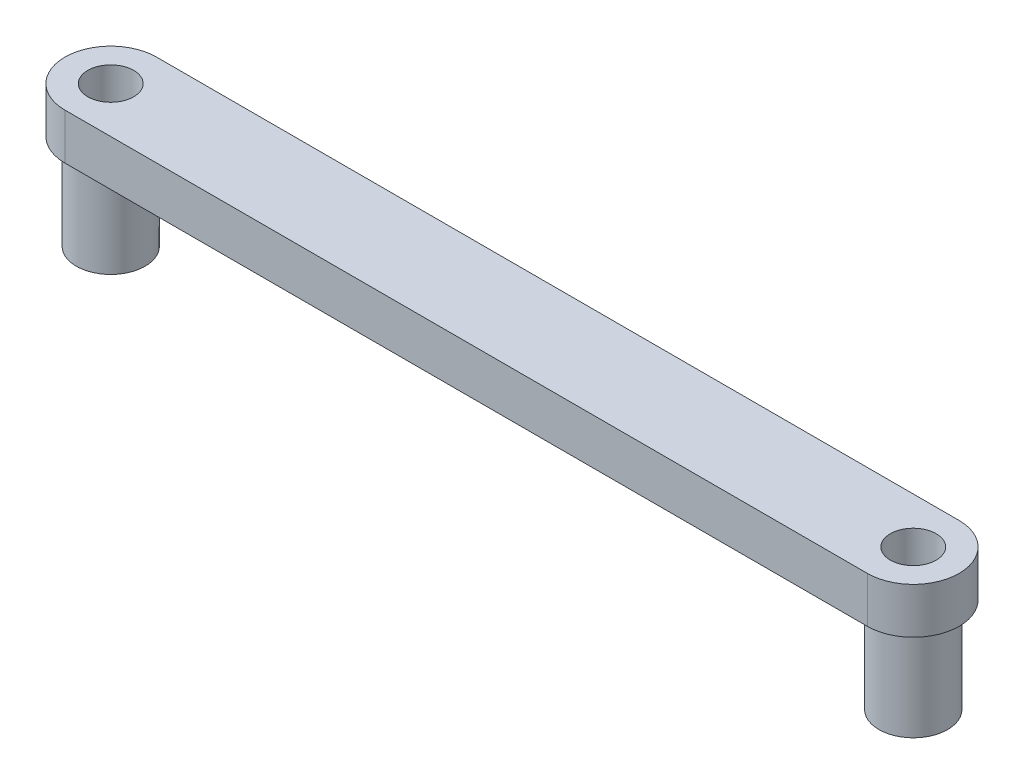
ISO-10303-21;
HEADER;
FILE_DESCRIPTION(('STEP AP214'),'2;1');
FILE_NAME('part.step','',(''),(''),'','','');
FILE_SCHEMA(('AUTOMOTIVE_DESIGN { 1 0 10303 214 1 1 1 1 }'));
ENDSEC;
DATA;
#1=APPLICATION_CONTEXT('core data for automotive mechanical design processes');
#2=APPLICATION_PROTOCOL_DEFINITION('international standard','automotive_design',2000,#1);
#3=PRODUCT_CONTEXT('',#1,'mechanical');
#4=PRODUCT('Part','Part','',(#3));
#5=PRODUCT_RELATED_PRODUCT_CATEGORY('part','',(#4));
#6=PRODUCT_DEFINITION_FORMATION('','',#4);
#7=PRODUCT_DEFINITION_CONTEXT('part definition',#1,'design');
#8=PRODUCT_DEFINITION('design','',#6,#7);
#9=PRODUCT_DEFINITION_SHAPE('','',#8);
#10=(LENGTH_UNIT() NAMED_UNIT(*) SI_UNIT(.MILLI.,.METRE.));
#11=(NAMED_UNIT(*) PLANE_ANGLE_UNIT() SI_UNIT($,.RADIAN.));
#12=(NAMED_UNIT(*) SI_UNIT($,.STERADIAN.) SOLID_ANGLE_UNIT());
#13=UNCERTAINTY_MEASURE_WITH_UNIT(LENGTH_MEASURE(1.E-05),#10,'distance_accuracy_value','');
#14=(GEOMETRIC_REPRESENTATION_CONTEXT(3) GLOBAL_UNCERTAINTY_ASSIGNED_CONTEXT((#13)) GLOBAL_UNIT_ASSIGNED_CONTEXT((#10,
#11,#12)) REPRESENTATION_CONTEXT('',''));
#15=CARTESIAN_POINT('',(0.,0.,0.));
#16=DIRECTION('',(0.,0.,1.));
#17=DIRECTION('',(1.,0.,0.));
#18=AXIS2_PLACEMENT_3D('',#15,#16,#17);
#19=CARTESIAN_POINT('',(0.,4.15,0.));
#20=DIRECTION('',(0.,-1.,0.));
#21=DIRECTION('',(0.,0.,-1.));
#22=AXIS2_PLACEMENT_3D('',#19,#20,#21);
#23=CYLINDRICAL_SURFACE('',#22,1.5);
#24=CARTESIAN_POINT('',(0.,4.15,0.));
#25=DIRECTION('',(0.,1.,0.));
#26=DIRECTION('',(0.,0.,1.));
#27=AXIS2_PLACEMENT_3D('',#24,#25,#26);
#28=CIRCLE('',#27,1.5);
#29=CARTESIAN_POINT('',(0.,4.15,-1.5));
#30=VERTEX_POINT('',#29);
#31=EDGE_CURVE('E48',#30,#30,#28,.T.);
#32=CARTESIAN_POINT('',(0.,0.,0.));
#33=DIRECTION('',(0.,1.,0.));
#34=DIRECTION('',(0.,0.,1.));
#35=AXIS2_PLACEMENT_3D('',#32,#33,#34);
#36=CIRCLE('',#35,1.5);
#37=CARTESIAN_POINT('',(0.,0.,-1.5));
#38=VERTEX_POINT('',#37);
#39=EDGE_CURVE('E128',#38,#38,#36,.T.);
#40=CARTESIAN_POINT('',(0.,4.15,-1.5));
#41=CARTESIAN_POINT('',(0.,4.10677083333333,-1.5));
#42=CARTESIAN_POINT('',(0.,4.06354166666667,-1.5));
#43=CARTESIAN_POINT('',(0.,3.97708333333333,-1.5));
#44=CARTESIAN_POINT('',(0.,3.93385416666667,-1.5));
#45=CARTESIAN_POINT('',(0.,3.84739583333333,-1.5));
#46=CARTESIAN_POINT('',(0.,3.80416666666667,-1.5));
#47=CARTESIAN_POINT('',(0.,3.71770833333333,-1.5));
#48=CARTESIAN_POINT('',(0.,3.67447916666667,-1.5));
#49=CARTESIAN_POINT('',(0.,3.58802083333333,-1.5));
#50=CARTESIAN_POINT('',(0.,3.54479166666667,-1.5));
#51=CARTESIAN_POINT('',(0.,3.45833333333333,-1.5));
#52=CARTESIAN_POINT('',(0.,3.41510416666667,-1.5));
#53=CARTESIAN_POINT('',(0.,3.32864583333333,-1.5));
#54=CARTESIAN_POINT('',(0.,3.28541666666667,-1.5));
#55=CARTESIAN_POINT('',(0.,3.19895833333333,-1.5));
#56=CARTESIAN_POINT('',(0.,3.15572916666667,-1.5));
#57=CARTESIAN_POINT('',(0.,3.06927083333333,-1.5));
#58=CARTESIAN_POINT('',(0.,3.02604166666667,-1.5));
#59=CARTESIAN_POINT('',(0.,2.93958333333333,-1.5));
#60=CARTESIAN_POINT('',(0.,2.89635416666667,-1.5));
#61=CARTESIAN_POINT('',(0.,2.80989583333333,-1.5));
#62=CARTESIAN_POINT('',(0.,2.76666666666667,-1.5));
#63=CARTESIAN_POINT('',(0.,2.68020833333333,-1.5));
#64=CARTESIAN_POINT('',(0.,2.63697916666667,-1.5));
#65=CARTESIAN_POINT('',(0.,2.55052083333333,-1.5));
#66=CARTESIAN_POINT('',(0.,2.50729166666667,-1.5));
#67=CARTESIAN_POINT('',(0.,2.42083333333333,-1.5));
#68=CARTESIAN_POINT('',(0.,2.37760416666667,-1.5));
#69=CARTESIAN_POINT('',(0.,2.29114583333333,-1.5));
#70=CARTESIAN_POINT('',(0.,2.24791666666667,-1.5));
#71=CARTESIAN_POINT('',(0.,2.16145833333333,-1.5));
#72=CARTESIAN_POINT('',(0.,2.11822916666667,-1.5));
#73=CARTESIAN_POINT('',(0.,2.03177083333333,-1.5));
#74=CARTESIAN_POINT('',(0.,1.98854166666667,-1.5));
#75=CARTESIAN_POINT('',(0.,1.90208333333333,-1.5));
#76=CARTESIAN_POINT('',(0.,1.85885416666667,-1.5));
#77=CARTESIAN_POINT('',(0.,1.77239583333333,-1.5));
#78=CARTESIAN_POINT('',(0.,1.72916666666667,-1.5));
#79=CARTESIAN_POINT('',(0.,1.64270833333333,-1.5));
#80=CARTESIAN_POINT('',(0.,1.59947916666667,-1.5));
#81=CARTESIAN_POINT('',(0.,1.51302083333333,-1.5));
#82=CARTESIAN_POINT('',(0.,1.46979166666667,-1.5));
#83=CARTESIAN_POINT('',(0.,1.38333333333333,-1.5));
#84=CARTESIAN_POINT('',(0.,1.34010416666667,-1.5));
#85=CARTESIAN_POINT('',(0.,1.25364583333333,-1.5));
#86=CARTESIAN_POINT('',(0.,1.21041666666667,-1.5));
#87=CARTESIAN_POINT('',(0.,1.12395833333333,-1.5));
#88=CARTESIAN_POINT('',(0.,1.08072916666667,-1.5));
#89=CARTESIAN_POINT('',(0.,0.994270833333334,-1.5));
#90=CARTESIAN_POINT('',(0.,0.951041666666667,-1.5));
#91=CARTESIAN_POINT('',(0.,0.864583333333333,-1.5));
#92=CARTESIAN_POINT('',(0.,0.821354166666667,-1.5));
#93=CARTESIAN_POINT('',(0.,0.734895833333334,-1.5));
#94=CARTESIAN_POINT('',(0.,0.691666666666667,-1.5));
#95=CARTESIAN_POINT('',(0.,0.605208333333333,-1.5));
#96=CARTESIAN_POINT('',(0.,0.561979166666667,-1.5));
#97=CARTESIAN_POINT('',(0.,0.475520833333333,-1.5));
#98=CARTESIAN_POINT('',(0.,0.432291666666667,-1.5));
#99=CARTESIAN_POINT('',(0.,0.345833333333333,-1.5));
#100=CARTESIAN_POINT('',(0.,0.302604166666667,-1.5));
#101=CARTESIAN_POINT('',(0.,0.216145833333333,-1.5));
#102=CARTESIAN_POINT('',(0.,0.172916666666666,-1.5));
#103=CARTESIAN_POINT('',(0.,0.0864583333333331,-1.5));
#104=CARTESIAN_POINT('',(0.,0.0432291666666665,-1.5));
#105=CARTESIAN_POINT('',(0.,0.,-1.5));
#106=B_SPLINE_CURVE_WITH_KNOTS('',3,(#40,#41,#42,#43,#44,#45,#46,#47,#48,#49,#50,#51,#52,#53,
#54,#55,#56,#57,#58,#59,#60,#61,#62,#63,#64,#65,#66,#67,#68,#69,#70,#71,#72,#73,#74,#75,#76,#77,
#78,#79,#80,#81,#82,#83,#84,#85,#86,#87,#88,#89,#90,#91,#92,#93,#94,#95,#96,#97,#98,#99,#100,
#101,#102,#103,#104,#105),.UNSPECIFIED.,.F.,.F.,(4,2,2,2,2,2,2,2,2,2,2,2,2,2,2,2,2,2,2,2,2,2,2,
2,2,2,2,2,2,2,2,2,4),(0.,0.1296875,0.259375,0.3890625,0.518749999999999,0.6484375,
0.778124999999999,0.907812499999999,1.0375,1.1671875,1.296875,1.4265625,1.55625,1.6859375,
1.815625,1.9453125,2.075,2.2046875,2.334375,2.4640625,2.59375,2.7234375,2.853125,2.9828125,
3.1125,3.2421875,3.371875,3.5015625,3.63125,3.7609375,3.890625,4.0203125,4.15),.UNSPECIFIED.);
#107=EDGE_CURVE('BSEAM39',#30,#38,#106,.T.);
#108=ORIENTED_EDGE('',*,*,#31,.F.);
#109=ORIENTED_EDGE('',*,*,#39,.T.);
#110=ORIENTED_EDGE('',*,*,#107,.T.);
#111=ORIENTED_EDGE('',*,*,#107,.F.);
#112=EDGE_LOOP('',(#108,#110,#109,#111));
#113=FACE_BOUND('',#112,.T.);
#114=ADVANCED_FACE('F39',(#113),#23,.T.);
#115=CARTESIAN_POINT('',(0.,0.,0.));
#116=DIRECTION('',(0.,1.,0.));
#117=DIRECTION('',(0.,0.,1.));
#118=AXIS2_PLACEMENT_3D('',#115,#116,#117);
#119=PLANE('',#118);
#120=CARTESIAN_POINT('',(0.,0.,0.));
#121=DIRECTION('',(0.,1.,0.));
#122=DIRECTION('',(0.,0.,1.));
#123=AXIS2_PLACEMENT_3D('',#120,#121,#122);
#124=CIRCLE('',#123,1.);
#125=CARTESIAN_POINT('',(0.,0.,1.));
#126=VERTEX_POINT('',#125);
#127=EDGE_CURVE('E182',#126,#126,#124,.T.);
#128=ORIENTED_EDGE('',*,*,#127,.T.);
#129=EDGE_LOOP('',(#128));
#130=FACE_BOUND('',#129,.T.);
#131=ORIENTED_EDGE('',*,*,#39,.F.);
#132=EDGE_LOOP('',(#131));
#133=FACE_BOUND('',#132,.T.);
#134=ADVANCED_FACE('F136',(#130,#133),#119,.F.);
#135=CARTESIAN_POINT('',(35.,6.15,0.));
#136=DIRECTION('',(0.,-1.,0.));
#137=DIRECTION('',(0.,0.,-1.));
#138=AXIS2_PLACEMENT_3D('',#135,#136,#137);
#139=CYLINDRICAL_SURFACE('',#138,2.);
#140=CARTESIAN_POINT('',(35.,4.15,0.));
#141=DIRECTION('',(0.,1.,0.));
#142=DIRECTION('',(0.,0.,1.));
#143=AXIS2_PLACEMENT_3D('',#140,#141,#142);
#144=CIRCLE('',#143,2.);
#145=CARTESIAN_POINT('',(35.,4.15,2.));
#146=VERTEX_POINT('',#145);
#147=CARTESIAN_POINT('',(35.,4.15,-2.));
#148=VERTEX_POINT('',#147);
#149=EDGE_CURVE('E111',#146,#148,#144,.T.);
#150=ORIENTED_EDGE('',*,*,#149,.T.);
#151=DIRECTION('',(0.,-1.,0.));
#152=VECTOR('',#151,1.);
#153=CARTESIAN_POINT('',(35.,6.15,-2.));
#154=LINE('',#153,#152);
#155=CARTESIAN_POINT('',(35.,6.15,-2.));
#156=VERTEX_POINT('',#155);
#157=EDGE_CURVE('E100',#156,#148,#154,.T.);
#158=ORIENTED_EDGE('',*,*,#157,.F.);
#159=CARTESIAN_POINT('',(35.,6.15,0.));
#160=DIRECTION('',(0.,1.,0.));
#161=DIRECTION('',(0.,0.,1.));
#162=AXIS2_PLACEMENT_3D('',#159,#160,#161);
#163=CIRCLE('',#162,2.);
#164=CARTESIAN_POINT('',(35.,6.15,2.));
#165=VERTEX_POINT('',#164);
#166=EDGE_CURVE('E92',#165,#156,#163,.T.);
#167=ORIENTED_EDGE('',*,*,#166,.F.);
#168=DIRECTION('',(0.,-1.,0.));
#169=VECTOR('',#168,1.);
#170=CARTESIAN_POINT('',(35.,6.15,2.));
#171=LINE('',#170,#169);
#172=EDGE_CURVE('E107',#165,#146,#171,.T.);
#173=ORIENTED_EDGE('',*,*,#172,.T.);
#174=EDGE_LOOP('',(#150,#158,#167,#173));
#175=FACE_BOUND('',#174,.T.);
#176=ADVANCED_FACE('F138',(#175),#139,.T.);
#177=CARTESIAN_POINT('',(35.,6.15,-2.));
#178=DIRECTION('',(0.,0.,1.));
#179=DIRECTION('',(1.,0.,0.));
#180=AXIS2_PLACEMENT_3D('',#177,#178,#179);
#181=PLANE('',#180);
#182=DIRECTION('',(-1.,0.,0.));
#183=VECTOR('',#182,1.);
#184=CARTESIAN_POINT('',(35.,4.15,-2.));
#185=LINE('',#184,#183);
#186=CARTESIAN_POINT('',(0.,4.15,-2.));
#187=VERTEX_POINT('',#186);
#188=EDGE_CURVE('E98',#148,#187,#185,.T.);
#189=ORIENTED_EDGE('',*,*,#188,.T.);
#190=DIRECTION('',(0.,-1.,0.));
#191=VECTOR('',#190,1.);
#192=CARTESIAN_POINT('',(0.,6.15,-2.));
#193=LINE('',#192,#191);
#194=CARTESIAN_POINT('',(0.,6.15,-2.));
#195=VERTEX_POINT('',#194);
#196=EDGE_CURVE('E96',#195,#187,#193,.T.);
#197=ORIENTED_EDGE('',*,*,#196,.F.);
#198=DIRECTION('',(-1.,0.,0.));
#199=VECTOR('',#198,1.);
#200=CARTESIAN_POINT('',(35.,6.15,-2.));
#201=LINE('',#200,#199);
#202=EDGE_CURVE('E87',#156,#195,#201,.T.);
#203=ORIENTED_EDGE('',*,*,#202,.F.);
#204=ORIENTED_EDGE('',*,*,#157,.T.);
#205=EDGE_LOOP('',(#189,#197,#203,#204));
#206=FACE_BOUND('',#205,.T.);
#207=ADVANCED_FACE('F97',(#206),#181,.F.);
#208=CARTESIAN_POINT('',(0.,6.15,0.));
#209=DIRECTION('',(0.,-1.,0.));
#210=DIRECTION('',(0.,0.,-1.));
#211=AXIS2_PLACEMENT_3D('',#208,#209,#210);
#212=CYLINDRICAL_SURFACE('',#211,2.);
#213=CARTESIAN_POINT('',(0.,4.15,0.));
#214=DIRECTION('',(0.,1.,0.));
#215=DIRECTION('',(0.,0.,1.));
#216=AXIS2_PLACEMENT_3D('',#213,#214,#215);
#217=CIRCLE('',#216,2.);
#218=CARTESIAN_POINT('',(0.,4.15,2.));
#219=VERTEX_POINT('',#218);
#220=EDGE_CURVE('E73',#187,#219,#217,.T.);
#221=ORIENTED_EDGE('',*,*,#220,.T.);
#222=DIRECTION('',(0.,-1.,0.));
#223=VECTOR('',#222,1.);
#224=CARTESIAN_POINT('',(0.,6.15,2.));
#225=LINE('',#224,#223);
#226=CARTESIAN_POINT('',(0.,6.15,2.));
#227=VERTEX_POINT('',#226);
#228=EDGE_CURVE('E101',#227,#219,#225,.T.);
#229=ORIENTED_EDGE('',*,*,#228,.F.);
#230=CARTESIAN_POINT('',(0.,6.15,0.));
#231=DIRECTION('',(0.,1.,0.));
#232=DIRECTION('',(0.,0.,1.));
#233=AXIS2_PLACEMENT_3D('',#230,#231,#232);
#234=CIRCLE('',#233,2.);
#235=EDGE_CURVE('E90',#195,#227,#234,.T.);
#236=ORIENTED_EDGE('',*,*,#235,.F.);
#237=ORIENTED_EDGE('',*,*,#196,.T.);
#238=EDGE_LOOP('',(#221,#229,#236,#237));
#239=FACE_BOUND('',#238,.T.);
#240=ADVANCED_FACE('F103',(#239),#212,.T.);
#241=CARTESIAN_POINT('',(0.,6.15,2.));
#242=DIRECTION('',(0.,0.,-1.));
#243=DIRECTION('',(-1.,0.,0.));
#244=AXIS2_PLACEMENT_3D('',#241,#242,#243);
#245=PLANE('',#244);
#246=DIRECTION('',(1.,0.,0.));
#247=VECTOR('',#246,1.);
#248=CARTESIAN_POINT('',(0.,4.15,2.));
#249=LINE('',#248,#247);
#250=EDGE_CURVE('E79',#219,#146,#249,.T.);
#251=ORIENTED_EDGE('',*,*,#250,.T.);
#252=ORIENTED_EDGE('',*,*,#172,.F.);
#253=DIRECTION('',(1.,0.,0.));
#254=VECTOR('',#253,1.);
#255=CARTESIAN_POINT('',(0.,6.15,2.));
#256=LINE('',#255,#254);
#257=EDGE_CURVE('E56',#227,#165,#256,.T.);
#258=ORIENTED_EDGE('',*,*,#257,.F.);
#259=ORIENTED_EDGE('',*,*,#228,.T.);
#260=EDGE_LOOP('',(#251,#252,#258,#259));
#261=FACE_BOUND('',#260,.T.);
#262=ADVANCED_FACE('F153',(#261),#245,.F.);
#263=CARTESIAN_POINT('',(35.,6.15,0.));
#264=DIRECTION('',(0.,1.,0.));
#265=DIRECTION('',(0.,0.,1.));
#266=AXIS2_PLACEMENT_3D('',#263,#264,#265);
#267=PLANE('',#266);
#268=CARTESIAN_POINT('',(0.,6.15,0.));
#269=DIRECTION('',(0.,1.,0.));
#270=DIRECTION('',(0.,0.,1.));
#271=AXIS2_PLACEMENT_3D('',#268,#269,#270);
#272=CIRCLE('',#271,1.);
#273=CARTESIAN_POINT('',(0.,6.15,1.));
#274=VERTEX_POINT('',#273);
#275=EDGE_CURVE('E185',#274,#274,#272,.T.);
#276=ORIENTED_EDGE('',*,*,#275,.F.);
#277=EDGE_LOOP('',(#276));
#278=FACE_BOUND('',#277,.T.);
#279=CARTESIAN_POINT('',(35.,6.15,0.));
#280=DIRECTION('',(0.,1.,0.));
#281=DIRECTION('',(0.,0.,1.));
#282=AXIS2_PLACEMENT_3D('',#279,#280,#281);
#283=CIRCLE('',#282,0.999999999999998);
#284=CARTESIAN_POINT('',(35.,6.15,0.999999999999998));
#285=VERTEX_POINT('',#284);
#286=EDGE_CURVE('E193',#285,#285,#283,.T.);
#287=ORIENTED_EDGE('',*,*,#286,.F.);
#288=EDGE_LOOP('',(#287));
#289=FACE_BOUND('',#288,.T.);
#290=ORIENTED_EDGE('',*,*,#166,.T.);
#291=ORIENTED_EDGE('',*,*,#202,.T.);
#292=ORIENTED_EDGE('',*,*,#235,.T.);
#293=ORIENTED_EDGE('',*,*,#257,.T.);
#294=EDGE_LOOP('',(#290,#291,#292,#293));
#295=FACE_BOUND('',#294,.T.);
#296=ADVANCED_FACE('F88',(#278,#289,#295),#267,.T.);
#297=CARTESIAN_POINT('',(35.,4.15,0.));
#298=DIRECTION('',(0.,1.,0.));
#299=DIRECTION('',(0.,0.,1.));
#300=AXIS2_PLACEMENT_3D('',#297,#298,#299);
#301=PLANE('',#300);
#302=CARTESIAN_POINT('',(35.,4.15,0.));
#303=DIRECTION('',(0.,1.,0.));
#304=DIRECTION('',(0.,0.,1.));
#305=AXIS2_PLACEMENT_3D('',#302,#303,#304);
#306=CIRCLE('',#305,1.5);
#307=CARTESIAN_POINT('',(35.,4.15,1.5));
#308=VERTEX_POINT('',#307);
#309=EDGE_CURVE('E11',#308,#308,#306,.F.);
#310=ORIENTED_EDGE('',*,*,#309,.F.);
#311=EDGE_LOOP('',(#310));
#312=FACE_BOUND('',#311,.T.);
#313=ORIENTED_EDGE('',*,*,#31,.T.);
#314=EDGE_LOOP('',(#313));
#315=FACE_BOUND('',#314,.T.);
#316=ORIENTED_EDGE('',*,*,#149,.F.);
#317=ORIENTED_EDGE('',*,*,#250,.F.);
#318=ORIENTED_EDGE('',*,*,#220,.F.);
#319=ORIENTED_EDGE('',*,*,#188,.F.);
#320=EDGE_LOOP('',(#316,#317,#318,#319));
#321=FACE_BOUND('',#320,.T.);
#322=ADVANCED_FACE('F156',(#312,#315,#321),#301,.F.);
#323=CARTESIAN_POINT('',(35.,-4.24264068711929,0.));
#324=DIRECTION('',(0.,1.,0.));
#325=DIRECTION('',(0.,0.,1.));
#326=AXIS2_PLACEMENT_3D('',#323,#324,#325);
#327=CYLINDRICAL_SURFACE('',#326,1.5);
#328=CARTESIAN_POINT('',(35.,0.,0.));
#329=DIRECTION('',(0.,1.,0.));
#330=DIRECTION('',(0.,0.,1.));
#331=AXIS2_PLACEMENT_3D('',#328,#329,#330);
#332=CIRCLE('',#331,1.5);
#333=CARTESIAN_POINT('',(35.,0.,1.5));
#334=VERTEX_POINT('',#333);
#335=EDGE_CURVE('E115',#334,#334,#332,.T.);
#336=ORIENTED_EDGE('',*,*,#335,.T.);
#337=EDGE_LOOP('',(#336));
#338=FACE_BOUND('',#337,.T.);
#339=ORIENTED_EDGE('',*,*,#309,.T.);
#340=EDGE_LOOP('',(#339));
#341=FACE_BOUND('',#340,.T.);
#342=ADVANCED_FACE('F159',(#338,#341),#327,.T.);
#343=CARTESIAN_POINT('',(0.,0.,0.));
#344=DIRECTION('',(0.,1.,0.));
#345=DIRECTION('',(0.,0.,1.));
#346=AXIS2_PLACEMENT_3D('',#343,#344,#345);
#347=PLANE('',#346);
#348=CARTESIAN_POINT('',(35.,0.,0.));
#349=DIRECTION('',(0.,1.,0.));
#350=DIRECTION('',(0.,0.,1.));
#351=AXIS2_PLACEMENT_3D('',#348,#349,#350);
#352=CIRCLE('',#351,0.999999999999998);
#353=CARTESIAN_POINT('',(35.,0.,0.999999999999998));
#354=VERTEX_POINT('',#353);
#355=EDGE_CURVE('E187',#354,#354,#352,.T.);
#356=ORIENTED_EDGE('',*,*,#355,.T.);
#357=EDGE_LOOP('',(#356));
#358=FACE_BOUND('',#357,.T.);
#359=ORIENTED_EDGE('',*,*,#335,.F.);
#360=EDGE_LOOP('',(#359));
#361=FACE_BOUND('',#360,.T.);
#362=ADVANCED_FACE('F166',(#358,#361),#347,.F.);
#363=CARTESIAN_POINT('',(35.,0.,0.));
#364=DIRECTION('',(0.,1.,0.));
#365=DIRECTION('',(0.,0.,1.));
#366=AXIS2_PLACEMENT_3D('',#363,#364,#365);
#367=CYLINDRICAL_SURFACE('',#366,0.999999999999998);
#368=ORIENTED_EDGE('',*,*,#355,.F.);
#369=EDGE_LOOP('',(#368));
#370=FACE_BOUND('',#369,.T.);
#371=ORIENTED_EDGE('',*,*,#286,.T.);
#372=EDGE_LOOP('',(#371));
#373=FACE_BOUND('',#372,.T.);
#374=ADVANCED_FACE('F170',(#370,#373),#367,.F.);
#375=CARTESIAN_POINT('',(0.,0.,0.));
#376=DIRECTION('',(0.,1.,0.));
#377=DIRECTION('',(0.,0.,1.));
#378=AXIS2_PLACEMENT_3D('',#375,#376,#377);
#379=CYLINDRICAL_SURFACE('',#378,1.);
#380=ORIENTED_EDGE('',*,*,#127,.F.);
#381=EDGE_LOOP('',(#380));
#382=FACE_BOUND('',#381,.T.);
#383=ORIENTED_EDGE('',*,*,#275,.T.);
#384=EDGE_LOOP('',(#383));
#385=FACE_BOUND('',#384,.T.);
#386=ADVANCED_FACE('F174',(#382,#385),#379,.F.);
#387=CLOSED_SHELL('',(#114,#134,#176,#207,#240,#262,#296,#322,#342,#362,#374,#386));
#388=MANIFOLD_SOLID_BREP('B2',#387);
#389=ADVANCED_BREP_SHAPE_REPRESENTATION('',(#18,#388),#14);
#390=SHAPE_DEFINITION_REPRESENTATION(#9,#389);
ENDSEC;
END-ISO-10303-21;
